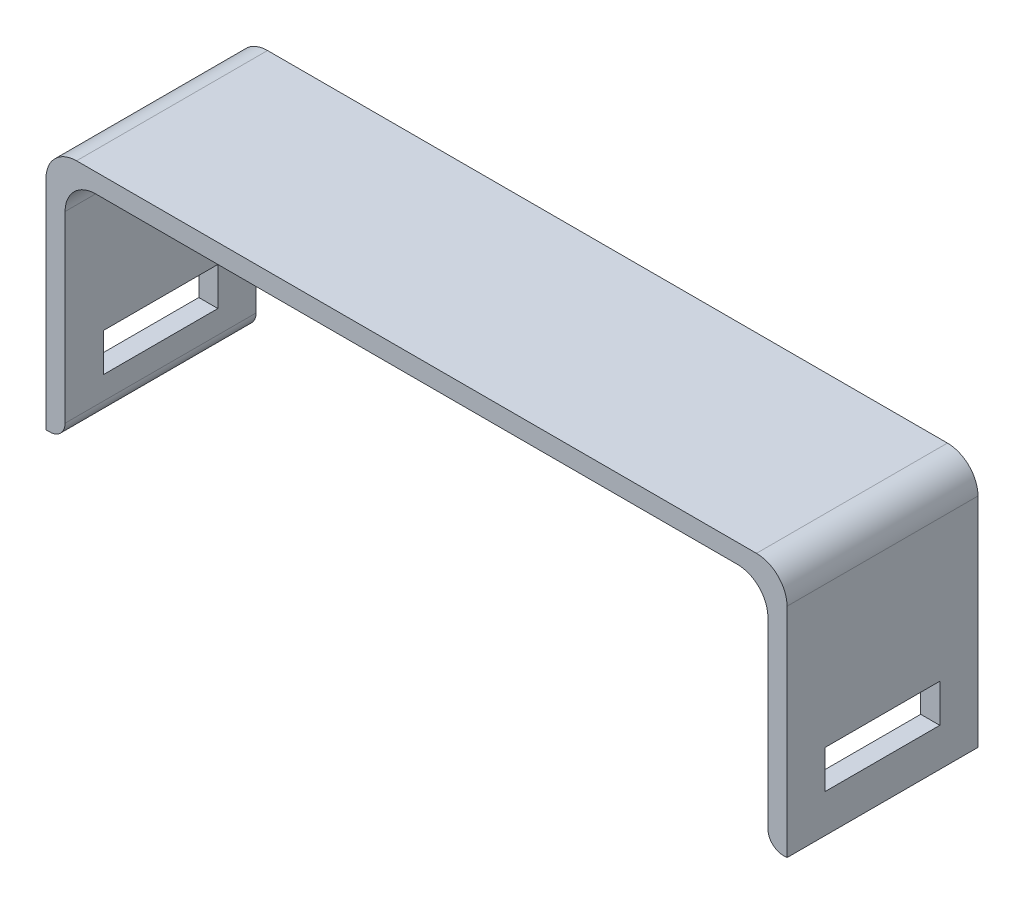
ISO-10303-21;
HEADER;
FILE_DESCRIPTION(('STEP AP214'),'2;1');
FILE_NAME('part.step','',(''),(''),'','','');
FILE_SCHEMA(('AUTOMOTIVE_DESIGN { 1 0 10303 214 1 1 1 1 }'));
ENDSEC;
DATA;
#1=APPLICATION_CONTEXT('core data for automotive mechanical design processes');
#2=APPLICATION_PROTOCOL_DEFINITION('international standard','automotive_design',2000,#1);
#3=PRODUCT_CONTEXT('',#1,'mechanical');
#4=PRODUCT('Part','Part','',(#3));
#5=PRODUCT_RELATED_PRODUCT_CATEGORY('part','',(#4));
#6=PRODUCT_DEFINITION_FORMATION('','',#4);
#7=PRODUCT_DEFINITION_CONTEXT('part definition',#1,'design');
#8=PRODUCT_DEFINITION('design','',#6,#7);
#9=PRODUCT_DEFINITION_SHAPE('','',#8);
#10=(LENGTH_UNIT() NAMED_UNIT(*) SI_UNIT(.MILLI.,.METRE.));
#11=(NAMED_UNIT(*) PLANE_ANGLE_UNIT() SI_UNIT($,.RADIAN.));
#12=(NAMED_UNIT(*) SI_UNIT($,.STERADIAN.) SOLID_ANGLE_UNIT());
#13=UNCERTAINTY_MEASURE_WITH_UNIT(LENGTH_MEASURE(1.E-05),#10,'distance_accuracy_value','');
#14=(GEOMETRIC_REPRESENTATION_CONTEXT(3) GLOBAL_UNCERTAINTY_ASSIGNED_CONTEXT((#13)) GLOBAL_UNIT_ASSIGNED_CONTEXT((#10,
#11,#12)) REPRESENTATION_CONTEXT('',''));
#15=CARTESIAN_POINT('',(0.,0.,0.));
#16=DIRECTION('',(0.,0.,1.));
#17=DIRECTION('',(1.,0.,0.));
#18=AXIS2_PLACEMENT_3D('',#15,#16,#17);
#19=CARTESIAN_POINT('',(3.175,0.,31.75));
#20=DIRECTION('',(0.,1.,0.));
#21=DIRECTION('',(-1.,0.,0.));
#22=AXIS2_PLACEMENT_3D('',#19,#20,#21);
#23=PLANE('',#22);
#24=DIRECTION('',(1.,0.,0.));
#25=VECTOR('',#24,1.);
#26=CARTESIAN_POINT('',(3.175,0.,0.));
#27=LINE('',#26,#25);
#28=CARTESIAN_POINT('',(0.,0.,0.));
#29=VERTEX_POINT('',#28);
#30=CARTESIAN_POINT('',(0.634999999999999,0.,0.));
#31=VERTEX_POINT('',#30);
#32=EDGE_CURVE('E258',#29,#31,#27,.T.);
#33=ORIENTED_EDGE('',*,*,#32,.T.);
#34=DIRECTION('',(0.,0.,-1.));
#35=VECTOR('',#34,1.);
#36=CARTESIAN_POINT('',(0.634999999999999,0.,31.75));
#37=LINE('',#36,#35);
#38=CARTESIAN_POINT('',(0.634999999999999,0.,31.75));
#39=VERTEX_POINT('',#38);
#40=EDGE_CURVE('E349',#31,#39,#37,.F.);
#41=ORIENTED_EDGE('',*,*,#40,.T.);
#42=DIRECTION('',(1.,0.,0.));
#43=VECTOR('',#42,1.);
#44=CARTESIAN_POINT('',(3.175,0.,31.75));
#45=LINE('',#44,#43);
#46=CARTESIAN_POINT('',(0.,0.,31.75));
#47=VERTEX_POINT('',#46);
#48=EDGE_CURVE('E259',#47,#39,#45,.T.);
#49=ORIENTED_EDGE('',*,*,#48,.F.);
#50=DIRECTION('',(0.,0.,-1.));
#51=VECTOR('',#50,1.);
#52=CARTESIAN_POINT('',(0.,0.,31.75));
#53=LINE('',#52,#51);
#54=EDGE_CURVE('E280',#47,#29,#53,.T.);
#55=ORIENTED_EDGE('',*,*,#54,.T.);
#56=EDGE_LOOP('',(#33,#41,#49,#55));
#57=FACE_BOUND('',#56,.T.);
#58=ADVANCED_FACE('F37',(#57),#23,.F.);
#59=CARTESIAN_POINT('',(3.175,38.1,31.75));
#60=DIRECTION('',(-1.,0.,0.));
#61=DIRECTION('',(0.,-1.,0.));
#62=AXIS2_PLACEMENT_3D('',#59,#60,#61);
#63=PLANE('',#62);
#64=DIRECTION('',(0.,0.,1.));
#65=VECTOR('',#64,1.);
#66=CARTESIAN_POINT('',(3.175,6.35,31.75));
#67=LINE('',#66,#65);
#68=CARTESIAN_POINT('',(3.175,6.35,6.35));
#69=VERTEX_POINT('',#68);
#70=CARTESIAN_POINT('',(3.175,6.35,25.4));
#71=VERTEX_POINT('',#70);
#72=EDGE_CURVE('E251',#69,#71,#67,.T.);
#73=ORIENTED_EDGE('',*,*,#72,.T.);
#74=DIRECTION('',(0.,1.,0.));
#75=VECTOR('',#74,1.);
#76=CARTESIAN_POINT('',(3.175,38.1,25.4));
#77=LINE('',#76,#75);
#78=CARTESIAN_POINT('',(3.175,12.7,25.4));
#79=VERTEX_POINT('',#78);
#80=EDGE_CURVE('E255',#71,#79,#77,.T.);
#81=ORIENTED_EDGE('',*,*,#80,.T.);
#82=DIRECTION('',(0.,0.,-1.));
#83=VECTOR('',#82,1.);
#84=CARTESIAN_POINT('',(3.175,12.7,31.75));
#85=LINE('',#84,#83);
#86=CARTESIAN_POINT('',(3.175,12.7,6.35));
#87=VERTEX_POINT('',#86);
#88=EDGE_CURVE('E239',#79,#87,#85,.T.);
#89=ORIENTED_EDGE('',*,*,#88,.T.);
#90=DIRECTION('',(0.,-1.,0.));
#91=VECTOR('',#90,1.);
#92=CARTESIAN_POINT('',(3.175,38.1,6.35));
#93=LINE('',#92,#91);
#94=EDGE_CURVE('E245',#87,#69,#93,.T.);
#95=ORIENTED_EDGE('',*,*,#94,.T.);
#96=EDGE_LOOP('',(#73,#81,#89,#95));
#97=FACE_BOUND('',#96,.T.);
#98=DIRECTION('',(0.,1.,0.));
#99=VECTOR('',#98,1.);
#100=CARTESIAN_POINT('',(3.175,38.1,31.75));
#101=LINE('',#100,#99);
#102=CARTESIAN_POINT('',(3.175,2.54000000000001,31.75));
#103=VERTEX_POINT('',#102);
#104=CARTESIAN_POINT('',(3.175,33.02,31.75));
#105=VERTEX_POINT('',#104);
#106=EDGE_CURVE('E262',#103,#105,#101,.T.);
#107=ORIENTED_EDGE('',*,*,#106,.F.);
#108=DIRECTION('',(0.,0.,-1.));
#109=VECTOR('',#108,1.);
#110=CARTESIAN_POINT('',(3.175,2.54,31.75));
#111=LINE('',#110,#109);
#112=CARTESIAN_POINT('',(3.175,2.54000000000001,0.));
#113=VERTEX_POINT('',#112);
#114=EDGE_CURVE('E342',#103,#113,#111,.T.);
#115=ORIENTED_EDGE('',*,*,#114,.T.);
#116=DIRECTION('',(0.,1.,0.));
#117=VECTOR('',#116,1.);
#118=CARTESIAN_POINT('',(3.175,38.1,0.));
#119=LINE('',#118,#117);
#120=CARTESIAN_POINT('',(3.175,33.02,0.));
#121=VERTEX_POINT('',#120);
#122=EDGE_CURVE('E283',#113,#121,#119,.T.);
#123=ORIENTED_EDGE('',*,*,#122,.T.);
#124=DIRECTION('',(0.,0.,-1.));
#125=VECTOR('',#124,1.);
#126=CARTESIAN_POINT('',(3.175,33.02,31.75));
#127=LINE('',#126,#125);
#128=EDGE_CURVE('E330',#121,#105,#127,.F.);
#129=ORIENTED_EDGE('',*,*,#128,.T.);
#130=EDGE_LOOP('',(#107,#115,#123,#129));
#131=FACE_BOUND('',#130,.T.);
#132=ADVANCED_FACE('F396',(#97,#131),#63,.F.);
#133=CARTESIAN_POINT('',(120.015,38.1,31.75));
#134=DIRECTION('',(0.,1.,0.));
#135=DIRECTION('',(-1.,0.,0.));
#136=AXIS2_PLACEMENT_3D('',#133,#134,#135);
#137=PLANE('',#136);
#138=DIRECTION('',(1.,0.,0.));
#139=VECTOR('',#138,1.);
#140=CARTESIAN_POINT('',(120.015,38.1,0.));
#141=LINE('',#140,#139);
#142=CARTESIAN_POINT('',(8.25500000000003,38.1,0.));
#143=VERTEX_POINT('',#142);
#144=CARTESIAN_POINT('',(114.935,38.1,0.));
#145=VERTEX_POINT('',#144);
#146=EDGE_CURVE('E285',#143,#145,#141,.T.);
#147=ORIENTED_EDGE('',*,*,#146,.T.);
#148=DIRECTION('',(0.,0.,-1.));
#149=VECTOR('',#148,1.);
#150=CARTESIAN_POINT('',(114.935,38.1,31.75));
#151=LINE('',#150,#149);
#152=CARTESIAN_POINT('',(114.935,38.1,31.75));
#153=VERTEX_POINT('',#152);
#154=EDGE_CURVE('E328',#145,#153,#151,.F.);
#155=ORIENTED_EDGE('',*,*,#154,.T.);
#156=DIRECTION('',(1.,0.,0.));
#157=VECTOR('',#156,1.);
#158=CARTESIAN_POINT('',(120.015,38.1,31.75));
#159=LINE('',#158,#157);
#160=CARTESIAN_POINT('',(8.25500000000003,38.1,31.75));
#161=VERTEX_POINT('',#160);
#162=EDGE_CURVE('E265',#161,#153,#159,.T.);
#163=ORIENTED_EDGE('',*,*,#162,.F.);
#164=DIRECTION('',(0.,0.,-1.));
#165=VECTOR('',#164,1.);
#166=CARTESIAN_POINT('',(8.255,38.1,0.));
#167=LINE('',#166,#165);
#168=EDGE_CURVE('E325',#161,#143,#167,.T.);
#169=ORIENTED_EDGE('',*,*,#168,.T.);
#170=EDGE_LOOP('',(#147,#155,#163,#169));
#171=FACE_BOUND('',#170,.T.);
#172=ADVANCED_FACE('F406',(#171),#137,.F.);
#173=CARTESIAN_POINT('',(120.015,0.,31.75));
#174=DIRECTION('',(1.,0.,0.));
#175=DIRECTION('',(0.,0.,-1.));
#176=AXIS2_PLACEMENT_3D('',#173,#174,#175);
#177=PLANE('',#176);
#178=DIRECTION('',(0.,0.,1.));
#179=VECTOR('',#178,1.);
#180=CARTESIAN_POINT('',(120.015,12.7,31.75));
#181=LINE('',#180,#179);
#182=CARTESIAN_POINT('',(120.015,12.7,6.35));
#183=VERTEX_POINT('',#182);
#184=CARTESIAN_POINT('',(120.015,12.7,25.4));
#185=VERTEX_POINT('',#184);
#186=EDGE_CURVE('E231',#183,#185,#181,.T.);
#187=ORIENTED_EDGE('',*,*,#186,.T.);
#188=DIRECTION('',(0.,-1.,0.));
#189=VECTOR('',#188,1.);
#190=CARTESIAN_POINT('',(120.015,0.,25.4));
#191=LINE('',#190,#189);
#192=CARTESIAN_POINT('',(120.015,6.35,25.4));
#193=VERTEX_POINT('',#192);
#194=EDGE_CURVE('E194',#185,#193,#191,.T.);
#195=ORIENTED_EDGE('',*,*,#194,.T.);
#196=DIRECTION('',(0.,0.,-1.));
#197=VECTOR('',#196,1.);
#198=CARTESIAN_POINT('',(120.015,6.35,31.75));
#199=LINE('',#198,#197);
#200=CARTESIAN_POINT('',(120.015,6.35,6.35));
#201=VERTEX_POINT('',#200);
#202=EDGE_CURVE('E248',#193,#201,#199,.T.);
#203=ORIENTED_EDGE('',*,*,#202,.T.);
#204=DIRECTION('',(0.,1.,0.));
#205=VECTOR('',#204,1.);
#206=CARTESIAN_POINT('',(120.015,0.,6.35));
#207=LINE('',#206,#205);
#208=EDGE_CURVE('E242',#201,#183,#207,.T.);
#209=ORIENTED_EDGE('',*,*,#208,.T.);
#210=EDGE_LOOP('',(#187,#195,#203,#209));
#211=FACE_BOUND('',#210,.T.);
#212=DIRECTION('',(0.,-1.,0.));
#213=VECTOR('',#212,1.);
#214=CARTESIAN_POINT('',(120.015,0.,0.));
#215=LINE('',#214,#213);
#216=CARTESIAN_POINT('',(120.015,33.02,0.));
#217=VERTEX_POINT('',#216);
#218=CARTESIAN_POINT('',(120.015,2.54,0.));
#219=VERTEX_POINT('',#218);
#220=EDGE_CURVE('E288',#217,#219,#215,.T.);
#221=ORIENTED_EDGE('',*,*,#220,.T.);
#222=DIRECTION('',(0.,0.,-1.));
#223=VECTOR('',#222,1.);
#224=CARTESIAN_POINT('',(120.015,2.54,31.75));
#225=LINE('',#224,#223);
#226=CARTESIAN_POINT('',(120.015,2.54,31.75));
#227=VERTEX_POINT('',#226);
#228=EDGE_CURVE('E11',#219,#227,#225,.F.);
#229=ORIENTED_EDGE('',*,*,#228,.T.);
#230=DIRECTION('',(0.,-1.,0.));
#231=VECTOR('',#230,1.);
#232=CARTESIAN_POINT('',(120.015,0.,31.75));
#233=LINE('',#232,#231);
#234=CARTESIAN_POINT('',(120.015,33.02,31.75));
#235=VERTEX_POINT('',#234);
#236=EDGE_CURVE('E268',#235,#227,#233,.T.);
#237=ORIENTED_EDGE('',*,*,#236,.F.);
#238=DIRECTION('',(0.,0.,-1.));
#239=VECTOR('',#238,1.);
#240=CARTESIAN_POINT('',(120.015,33.02,0.));
#241=LINE('',#240,#239);
#242=EDGE_CURVE('E322',#235,#217,#241,.T.);
#243=ORIENTED_EDGE('',*,*,#242,.T.);
#244=EDGE_LOOP('',(#221,#229,#237,#243));
#245=FACE_BOUND('',#244,.T.);
#246=ADVANCED_FACE('F411',(#211,#245),#177,.F.);
#247=CARTESIAN_POINT('',(123.19,0.,31.75));
#248=DIRECTION('',(0.,1.,0.));
#249=DIRECTION('',(-1.,0.,0.));
#250=AXIS2_PLACEMENT_3D('',#247,#248,#249);
#251=PLANE('',#250);
#252=DIRECTION('',(1.,0.,0.));
#253=VECTOR('',#252,1.);
#254=CARTESIAN_POINT('',(123.19,0.,31.75));
#255=LINE('',#254,#253);
#256=CARTESIAN_POINT('',(122.555,0.,31.75));
#257=VERTEX_POINT('',#256);
#258=CARTESIAN_POINT('',(123.19,0.,31.75));
#259=VERTEX_POINT('',#258);
#260=EDGE_CURVE('E270',#257,#259,#255,.T.);
#261=ORIENTED_EDGE('',*,*,#260,.F.);
#262=DIRECTION('',(0.,0.,-1.));
#263=VECTOR('',#262,1.);
#264=CARTESIAN_POINT('',(122.555,0.,31.75));
#265=LINE('',#264,#263);
#266=CARTESIAN_POINT('',(122.555,0.,0.));
#267=VERTEX_POINT('',#266);
#268=EDGE_CURVE('E45',#257,#267,#265,.T.);
#269=ORIENTED_EDGE('',*,*,#268,.T.);
#270=DIRECTION('',(1.,0.,0.));
#271=VECTOR('',#270,1.);
#272=CARTESIAN_POINT('',(123.19,0.,0.));
#273=LINE('',#272,#271);
#274=CARTESIAN_POINT('',(123.19,0.,0.));
#275=VERTEX_POINT('',#274);
#276=EDGE_CURVE('E290',#267,#275,#273,.T.);
#277=ORIENTED_EDGE('',*,*,#276,.T.);
#278=DIRECTION('',(0.,0.,-1.));
#279=VECTOR('',#278,1.);
#280=CARTESIAN_POINT('',(123.19,0.,31.75));
#281=LINE('',#280,#279);
#282=EDGE_CURVE('E301',#259,#275,#281,.T.);
#283=ORIENTED_EDGE('',*,*,#282,.F.);
#284=EDGE_LOOP('',(#261,#269,#277,#283));
#285=FACE_BOUND('',#284,.T.);
#286=ADVANCED_FACE('F357',(#285),#251,.F.);
#287=CARTESIAN_POINT('',(123.19,41.275,31.75));
#288=DIRECTION('',(-1.,0.,0.));
#289=DIRECTION('',(0.,0.,1.));
#290=AXIS2_PLACEMENT_3D('',#287,#288,#289);
#291=PLANE('',#290);
#292=DIRECTION('',(0.,0.,1.));
#293=VECTOR('',#292,1.);
#294=CARTESIAN_POINT('',(123.19,6.35,6.35));
#295=LINE('',#294,#293);
#296=CARTESIAN_POINT('',(123.19,6.35,6.35));
#297=VERTEX_POINT('',#296);
#298=CARTESIAN_POINT('',(123.19,6.35,25.4));
#299=VERTEX_POINT('',#298);
#300=EDGE_CURVE('E213',#297,#299,#295,.T.);
#301=ORIENTED_EDGE('',*,*,#300,.T.);
#302=DIRECTION('',(0.,1.,0.));
#303=VECTOR('',#302,1.);
#304=CARTESIAN_POINT('',(123.19,12.7,25.4));
#305=LINE('',#304,#303);
#306=CARTESIAN_POINT('',(123.19,12.7,25.4));
#307=VERTEX_POINT('',#306);
#308=EDGE_CURVE('E191',#299,#307,#305,.T.);
#309=ORIENTED_EDGE('',*,*,#308,.T.);
#310=DIRECTION('',(0.,0.,-1.));
#311=VECTOR('',#310,1.);
#312=CARTESIAN_POINT('',(123.19,12.7,6.35));
#313=LINE('',#312,#311);
#314=CARTESIAN_POINT('',(123.19,12.7,6.35));
#315=VERTEX_POINT('',#314);
#316=EDGE_CURVE('E202',#307,#315,#313,.T.);
#317=ORIENTED_EDGE('',*,*,#316,.T.);
#318=DIRECTION('',(0.,-1.,0.));
#319=VECTOR('',#318,1.);
#320=CARTESIAN_POINT('',(123.19,12.7,6.35));
#321=LINE('',#320,#319);
#322=EDGE_CURVE('E208',#315,#297,#321,.T.);
#323=ORIENTED_EDGE('',*,*,#322,.T.);
#324=EDGE_LOOP('',(#301,#309,#317,#323));
#325=FACE_BOUND('',#324,.T.);
#326=DIRECTION('',(0.,1.,0.));
#327=VECTOR('',#326,1.);
#328=CARTESIAN_POINT('',(123.19,41.275,0.));
#329=LINE('',#328,#327);
#330=CARTESIAN_POINT('',(123.19,36.195,0.));
#331=VERTEX_POINT('',#330);
#332=EDGE_CURVE('E292',#275,#331,#329,.T.);
#333=ORIENTED_EDGE('',*,*,#332,.T.);
#334=DIRECTION('',(0.,0.,-1.));
#335=VECTOR('',#334,1.);
#336=CARTESIAN_POINT('',(123.19,36.195,31.75));
#337=LINE('',#336,#335);
#338=CARTESIAN_POINT('',(123.19,36.195,31.75));
#339=VERTEX_POINT('',#338);
#340=EDGE_CURVE('E313',#331,#339,#337,.F.);
#341=ORIENTED_EDGE('',*,*,#340,.T.);
#342=DIRECTION('',(0.,1.,0.));
#343=VECTOR('',#342,1.);
#344=CARTESIAN_POINT('',(123.19,41.275,31.75));
#345=LINE('',#344,#343);
#346=EDGE_CURVE('E272',#259,#339,#345,.T.);
#347=ORIENTED_EDGE('',*,*,#346,.F.);
#348=ORIENTED_EDGE('',*,*,#282,.T.);
#349=EDGE_LOOP('',(#333,#341,#347,#348));
#350=FACE_BOUND('',#349,.T.);
#351=ADVANCED_FACE('F210',(#325,#350),#291,.F.);
#352=CARTESIAN_POINT('',(0.,41.275,31.75));
#353=DIRECTION('',(0.,-1.,0.));
#354=DIRECTION('',(0.,0.,-1.));
#355=AXIS2_PLACEMENT_3D('',#352,#353,#354);
#356=PLANE('',#355);
#357=DIRECTION('',(-1.,0.,0.));
#358=VECTOR('',#357,1.);
#359=CARTESIAN_POINT('',(0.,41.275,31.75));
#360=LINE('',#359,#358);
#361=CARTESIAN_POINT('',(118.11,41.275,31.75));
#362=VERTEX_POINT('',#361);
#363=CARTESIAN_POINT('',(5.08,41.275,31.75));
#364=VERTEX_POINT('',#363);
#365=EDGE_CURVE('E275',#362,#364,#360,.T.);
#366=ORIENTED_EDGE('',*,*,#365,.F.);
#367=DIRECTION('',(0.,0.,-1.));
#368=VECTOR('',#367,1.);
#369=CARTESIAN_POINT('',(118.11,41.275,31.75));
#370=LINE('',#369,#368);
#371=CARTESIAN_POINT('',(118.11,41.275,0.));
#372=VERTEX_POINT('',#371);
#373=EDGE_CURVE('E306',#362,#372,#370,.T.);
#374=ORIENTED_EDGE('',*,*,#373,.T.);
#375=DIRECTION('',(-1.,0.,0.));
#376=VECTOR('',#375,1.);
#377=CARTESIAN_POINT('',(0.,41.275,0.));
#378=LINE('',#377,#376);
#379=CARTESIAN_POINT('',(5.08,41.275,0.));
#380=VERTEX_POINT('',#379);
#381=EDGE_CURVE('E295',#372,#380,#378,.T.);
#382=ORIENTED_EDGE('',*,*,#381,.T.);
#383=DIRECTION('',(0.,0.,-1.));
#384=VECTOR('',#383,1.);
#385=CARTESIAN_POINT('',(5.08,41.275,31.75));
#386=LINE('',#385,#384);
#387=EDGE_CURVE('E304',#380,#364,#386,.F.);
#388=ORIENTED_EDGE('',*,*,#387,.T.);
#389=EDGE_LOOP('',(#366,#374,#382,#388));
#390=FACE_BOUND('',#389,.T.);
#391=ADVANCED_FACE('F376',(#390),#356,.F.);
#392=CARTESIAN_POINT('',(0.,0.,31.75));
#393=DIRECTION('',(1.,0.,0.));
#394=DIRECTION('',(0.,0.,-1.));
#395=AXIS2_PLACEMENT_3D('',#392,#393,#394);
#396=PLANE('',#395);
#397=DIRECTION('',(0.,0.,-1.));
#398=VECTOR('',#397,1.);
#399=CARTESIAN_POINT('',(0.,12.7,6.35));
#400=LINE('',#399,#398);
#401=CARTESIAN_POINT('',(0.,12.7,25.4));
#402=VERTEX_POINT('',#401);
#403=CARTESIAN_POINT('',(0.,12.7,6.35));
#404=VERTEX_POINT('',#403);
#405=EDGE_CURVE('E224',#402,#404,#400,.T.);
#406=ORIENTED_EDGE('',*,*,#405,.F.);
#407=DIRECTION('',(0.,1.,0.));
#408=VECTOR('',#407,1.);
#409=CARTESIAN_POINT('',(0.,12.7,25.4));
#410=LINE('',#409,#408);
#411=CARTESIAN_POINT('',(0.,6.35,25.4));
#412=VERTEX_POINT('',#411);
#413=EDGE_CURVE('E222',#412,#402,#410,.T.);
#414=ORIENTED_EDGE('',*,*,#413,.F.);
#415=DIRECTION('',(0.,0.,1.));
#416=VECTOR('',#415,1.);
#417=CARTESIAN_POINT('',(0.,6.35,6.35));
#418=LINE('',#417,#416);
#419=CARTESIAN_POINT('',(0.,6.35,6.35));
#420=VERTEX_POINT('',#419);
#421=EDGE_CURVE('E214',#420,#412,#418,.T.);
#422=ORIENTED_EDGE('',*,*,#421,.F.);
#423=DIRECTION('',(0.,-1.,0.));
#424=VECTOR('',#423,1.);
#425=CARTESIAN_POINT('',(0.,12.7,6.35));
#426=LINE('',#425,#424);
#427=EDGE_CURVE('E217',#404,#420,#426,.T.);
#428=ORIENTED_EDGE('',*,*,#427,.F.);
#429=EDGE_LOOP('',(#406,#414,#422,#428));
#430=FACE_BOUND('',#429,.T.);
#431=DIRECTION('',(0.,-1.,0.));
#432=VECTOR('',#431,1.);
#433=CARTESIAN_POINT('',(0.,0.,31.75));
#434=LINE('',#433,#432);
#435=CARTESIAN_POINT('',(0.,36.195,31.75));
#436=VERTEX_POINT('',#435);
#437=EDGE_CURVE('E278',#436,#47,#434,.T.);
#438=ORIENTED_EDGE('',*,*,#437,.F.);
#439=DIRECTION('',(0.,0.,-1.));
#440=VECTOR('',#439,1.);
#441=CARTESIAN_POINT('',(0.,36.195,31.75));
#442=LINE('',#441,#440);
#443=CARTESIAN_POINT('',(0.,36.195,0.));
#444=VERTEX_POINT('',#443);
#445=EDGE_CURVE('E319',#436,#444,#442,.T.);
#446=ORIENTED_EDGE('',*,*,#445,.T.);
#447=DIRECTION('',(0.,-1.,0.));
#448=VECTOR('',#447,1.);
#449=CARTESIAN_POINT('',(0.,0.,0.));
#450=LINE('',#449,#448);
#451=EDGE_CURVE('E263',#444,#29,#450,.T.);
#452=ORIENTED_EDGE('',*,*,#451,.T.);
#453=ORIENTED_EDGE('',*,*,#54,.F.);
#454=EDGE_LOOP('',(#438,#446,#452,#453));
#455=FACE_BOUND('',#454,.T.);
#456=ADVANCED_FACE('F384',(#430,#455),#396,.F.);
#457=CARTESIAN_POINT('',(0.,0.,31.75));
#458=DIRECTION('',(0.,0.,-1.));
#459=DIRECTION('',(-1.,0.,0.));
#460=AXIS2_PLACEMENT_3D('',#457,#458,#459);
#461=PLANE('',#460);
#462=ORIENTED_EDGE('',*,*,#48,.T.);
#463=CARTESIAN_POINT('',(0.634999999999999,2.54,31.75));
#464=DIRECTION('',(0.,0.,-1.));
#465=DIRECTION('',(-1.,0.,0.));
#466=AXIS2_PLACEMENT_3D('',#463,#464,#465);
#467=CIRCLE('',#466,2.54);
#468=EDGE_CURVE('E352',#39,#103,#467,.F.);
#469=ORIENTED_EDGE('',*,*,#468,.T.);
#470=ORIENTED_EDGE('',*,*,#106,.T.);
#471=CARTESIAN_POINT('',(8.255,33.02,31.75));
#472=DIRECTION('',(0.,0.,-1.));
#473=DIRECTION('',(-1.,0.,0.));
#474=AXIS2_PLACEMENT_3D('',#471,#472,#473);
#475=CIRCLE('',#474,5.08);
#476=EDGE_CURVE('E340',#105,#161,#475,.T.);
#477=ORIENTED_EDGE('',*,*,#476,.T.);
#478=ORIENTED_EDGE('',*,*,#162,.T.);
#479=CARTESIAN_POINT('',(114.935,33.02,31.75));
#480=DIRECTION('',(0.,0.,-1.));
#481=DIRECTION('',(-1.,0.,0.));
#482=AXIS2_PLACEMENT_3D('',#479,#480,#481);
#483=CIRCLE('',#482,5.08);
#484=EDGE_CURVE('E335',#153,#235,#483,.T.);
#485=ORIENTED_EDGE('',*,*,#484,.T.);
#486=ORIENTED_EDGE('',*,*,#236,.T.);
#487=CARTESIAN_POINT('',(122.555,2.54,31.75));
#488=DIRECTION('',(0.,0.,-1.));
#489=DIRECTION('',(-1.,0.,0.));
#490=AXIS2_PLACEMENT_3D('',#487,#488,#489);
#491=CIRCLE('',#490,2.54);
#492=EDGE_CURVE('E52',#227,#257,#491,.F.);
#493=ORIENTED_EDGE('',*,*,#492,.T.);
#494=ORIENTED_EDGE('',*,*,#260,.T.);
#495=ORIENTED_EDGE('',*,*,#346,.T.);
#496=CARTESIAN_POINT('',(118.11,36.195,31.75));
#497=DIRECTION('',(0.,0.,-1.));
#498=DIRECTION('',(-1.,0.,0.));
#499=AXIS2_PLACEMENT_3D('',#496,#497,#498);
#500=CIRCLE('',#499,5.08);
#501=EDGE_CURVE('E317',#339,#362,#500,.F.);
#502=ORIENTED_EDGE('',*,*,#501,.T.);
#503=ORIENTED_EDGE('',*,*,#365,.T.);
#504=CARTESIAN_POINT('',(5.08,36.195,31.75));
#505=DIRECTION('',(0.,0.,-1.));
#506=DIRECTION('',(-1.,0.,0.));
#507=AXIS2_PLACEMENT_3D('',#504,#505,#506);
#508=CIRCLE('',#507,5.08);
#509=EDGE_CURVE('E315',#364,#436,#508,.F.);
#510=ORIENTED_EDGE('',*,*,#509,.T.);
#511=ORIENTED_EDGE('',*,*,#437,.T.);
#512=EDGE_LOOP('',(#462,#469,#470,#477,#478,#485,#486,#493,#494,#495,#502,#503,#510,#511));
#513=FACE_BOUND('',#512,.T.);
#514=ADVANCED_FACE('F373',(#513),#461,.F.);
#515=CARTESIAN_POINT('',(0.,0.,0.));
#516=DIRECTION('',(0.,0.,-1.));
#517=DIRECTION('',(-1.,0.,0.));
#518=AXIS2_PLACEMENT_3D('',#515,#516,#517);
#519=PLANE('',#518);
#520=ORIENTED_EDGE('',*,*,#122,.F.);
#521=CARTESIAN_POINT('',(0.634999999999999,2.54,0.));
#522=DIRECTION('',(0.,0.,-1.));
#523=DIRECTION('',(-1.,0.,0.));
#524=AXIS2_PLACEMENT_3D('',#521,#522,#523);
#525=CIRCLE('',#524,2.54);
#526=EDGE_CURVE('E347',#113,#31,#525,.T.);
#527=ORIENTED_EDGE('',*,*,#526,.T.);
#528=ORIENTED_EDGE('',*,*,#32,.F.);
#529=ORIENTED_EDGE('',*,*,#451,.F.);
#530=CARTESIAN_POINT('',(5.08,36.195,0.));
#531=DIRECTION('',(0.,0.,-1.));
#532=DIRECTION('',(-1.,0.,0.));
#533=AXIS2_PLACEMENT_3D('',#530,#531,#532);
#534=CIRCLE('',#533,5.08);
#535=EDGE_CURVE('E309',#444,#380,#534,.T.);
#536=ORIENTED_EDGE('',*,*,#535,.T.);
#537=ORIENTED_EDGE('',*,*,#381,.F.);
#538=CARTESIAN_POINT('',(118.11,36.195,0.));
#539=DIRECTION('',(0.,0.,-1.));
#540=DIRECTION('',(-1.,0.,0.));
#541=AXIS2_PLACEMENT_3D('',#538,#539,#540);
#542=CIRCLE('',#541,5.08);
#543=EDGE_CURVE('E311',#372,#331,#542,.T.);
#544=ORIENTED_EDGE('',*,*,#543,.T.);
#545=ORIENTED_EDGE('',*,*,#332,.F.);
#546=ORIENTED_EDGE('',*,*,#276,.F.);
#547=CARTESIAN_POINT('',(122.555,2.54,0.));
#548=DIRECTION('',(0.,0.,-1.));
#549=DIRECTION('',(-1.,0.,0.));
#550=AXIS2_PLACEMENT_3D('',#547,#548,#549);
#551=CIRCLE('',#550,2.54);
#552=EDGE_CURVE('E345',#267,#219,#551,.T.);
#553=ORIENTED_EDGE('',*,*,#552,.T.);
#554=ORIENTED_EDGE('',*,*,#220,.F.);
#555=CARTESIAN_POINT('',(114.935,33.02,0.));
#556=DIRECTION('',(0.,0.,-1.));
#557=DIRECTION('',(-1.,0.,0.));
#558=AXIS2_PLACEMENT_3D('',#555,#556,#557);
#559=CIRCLE('',#558,5.08);
#560=EDGE_CURVE('E333',#217,#145,#559,.F.);
#561=ORIENTED_EDGE('',*,*,#560,.T.);
#562=ORIENTED_EDGE('',*,*,#146,.F.);
#563=CARTESIAN_POINT('',(8.255,33.02,0.));
#564=DIRECTION('',(0.,0.,-1.));
#565=DIRECTION('',(-1.,0.,0.));
#566=AXIS2_PLACEMENT_3D('',#563,#564,#565);
#567=CIRCLE('',#566,5.08);
#568=EDGE_CURVE('E337',#143,#121,#567,.F.);
#569=ORIENTED_EDGE('',*,*,#568,.T.);
#570=EDGE_LOOP('',(#520,#527,#528,#529,#536,#537,#544,#545,#546,#553,#554,#561,#562,#569));
#571=FACE_BOUND('',#570,.T.);
#572=ADVANCED_FACE('F363',(#571),#519,.T.);
#573=CARTESIAN_POINT('',(123.19,12.7,6.35));
#574=DIRECTION('',(0.,1.,0.));
#575=DIRECTION('',(0.,0.,1.));
#576=AXIS2_PLACEMENT_3D('',#573,#574,#575);
#577=PLANE('',#576);
#578=DIRECTION('',(-1.,0.,0.));
#579=VECTOR('',#578,1.);
#580=CARTESIAN_POINT('',(123.19,12.7,25.4));
#581=LINE('',#580,#579);
#582=EDGE_CURVE('E198',#79,#402,#581,.T.);
#583=ORIENTED_EDGE('',*,*,#582,.T.);
#584=ORIENTED_EDGE('',*,*,#405,.T.);
#585=DIRECTION('',(-1.,0.,0.));
#586=VECTOR('',#585,1.);
#587=CARTESIAN_POINT('',(123.19,12.7,6.35));
#588=LINE('',#587,#586);
#589=EDGE_CURVE('E197',#87,#404,#588,.T.);
#590=ORIENTED_EDGE('',*,*,#589,.F.);
#591=ORIENTED_EDGE('',*,*,#88,.F.);
#592=EDGE_LOOP('',(#583,#584,#590,#591));
#593=FACE_BOUND('',#592,.T.);
#594=ADVANCED_FACE('F485',(#593),#577,.F.);
#595=CARTESIAN_POINT('',(123.19,12.7,6.35));
#596=DIRECTION('',(0.,0.,-1.));
#597=DIRECTION('',(0.,1.,0.));
#598=AXIS2_PLACEMENT_3D('',#595,#596,#597);
#599=PLANE('',#598);
#600=ORIENTED_EDGE('',*,*,#589,.T.);
#601=ORIENTED_EDGE('',*,*,#427,.T.);
#602=DIRECTION('',(-1.,0.,0.));
#603=VECTOR('',#602,1.);
#604=CARTESIAN_POINT('',(123.19,6.35,6.35));
#605=LINE('',#604,#603);
#606=EDGE_CURVE('E236',#69,#420,#605,.T.);
#607=ORIENTED_EDGE('',*,*,#606,.F.);
#608=ORIENTED_EDGE('',*,*,#94,.F.);
#609=EDGE_LOOP('',(#600,#601,#607,#608));
#610=FACE_BOUND('',#609,.T.);
#611=ADVANCED_FACE('F496',(#610),#599,.F.);
#612=CARTESIAN_POINT('',(123.19,6.35,6.35));
#613=DIRECTION('',(0.,-1.,0.));
#614=DIRECTION('',(0.,0.,-1.));
#615=AXIS2_PLACEMENT_3D('',#612,#613,#614);
#616=PLANE('',#615);
#617=ORIENTED_EDGE('',*,*,#606,.T.);
#618=ORIENTED_EDGE('',*,*,#421,.T.);
#619=DIRECTION('',(-1.,0.,0.));
#620=VECTOR('',#619,1.);
#621=CARTESIAN_POINT('',(123.19,6.35,25.4));
#622=LINE('',#621,#620);
#623=EDGE_CURVE('E232',#71,#412,#622,.T.);
#624=ORIENTED_EDGE('',*,*,#623,.F.);
#625=ORIENTED_EDGE('',*,*,#72,.F.);
#626=EDGE_LOOP('',(#617,#618,#624,#625));
#627=FACE_BOUND('',#626,.T.);
#628=ADVANCED_FACE('F506',(#627),#616,.F.);
#629=CARTESIAN_POINT('',(123.19,12.7,25.4));
#630=DIRECTION('',(0.,0.,1.));
#631=DIRECTION('',(1.,0.,0.));
#632=AXIS2_PLACEMENT_3D('',#629,#630,#631);
#633=PLANE('',#632);
#634=ORIENTED_EDGE('',*,*,#623,.T.);
#635=ORIENTED_EDGE('',*,*,#413,.T.);
#636=ORIENTED_EDGE('',*,*,#582,.F.);
#637=ORIENTED_EDGE('',*,*,#80,.F.);
#638=EDGE_LOOP('',(#634,#635,#636,#637));
#639=FACE_BOUND('',#638,.T.);
#640=ADVANCED_FACE('F514',(#639),#633,.F.);
#641=EDGE_CURVE('E186',#307,#185,#581,.T.);
#642=ORIENTED_EDGE('',*,*,#641,.F.);
#643=ORIENTED_EDGE('',*,*,#308,.F.);
#644=EDGE_CURVE('E229',#299,#193,#622,.T.);
#645=ORIENTED_EDGE('',*,*,#644,.T.);
#646=ORIENTED_EDGE('',*,*,#194,.F.);
#647=EDGE_LOOP('',(#642,#643,#645,#646));
#648=FACE_BOUND('',#647,.T.);
#649=ADVANCED_FACE('F188',(#648),#633,.F.);
#650=ORIENTED_EDGE('',*,*,#644,.F.);
#651=ORIENTED_EDGE('',*,*,#300,.F.);
#652=EDGE_CURVE('E233',#297,#201,#605,.T.);
#653=ORIENTED_EDGE('',*,*,#652,.T.);
#654=ORIENTED_EDGE('',*,*,#202,.F.);
#655=EDGE_LOOP('',(#650,#651,#653,#654));
#656=FACE_BOUND('',#655,.T.);
#657=ADVANCED_FACE('F493',(#656),#616,.F.);
#658=ORIENTED_EDGE('',*,*,#652,.F.);
#659=ORIENTED_EDGE('',*,*,#322,.F.);
#660=EDGE_CURVE('E205',#315,#183,#588,.T.);
#661=ORIENTED_EDGE('',*,*,#660,.T.);
#662=ORIENTED_EDGE('',*,*,#208,.F.);
#663=EDGE_LOOP('',(#658,#659,#661,#662));
#664=FACE_BOUND('',#663,.T.);
#665=ADVANCED_FACE('F483',(#664),#599,.F.);
#666=ORIENTED_EDGE('',*,*,#660,.F.);
#667=ORIENTED_EDGE('',*,*,#316,.F.);
#668=ORIENTED_EDGE('',*,*,#641,.T.);
#669=ORIENTED_EDGE('',*,*,#186,.F.);
#670=EDGE_LOOP('',(#666,#667,#668,#669));
#671=FACE_BOUND('',#670,.T.);
#672=ADVANCED_FACE('F203',(#671),#577,.F.);
#673=CARTESIAN_POINT('',(118.11,36.195,31.75));
#674=DIRECTION('',(0.,0.,-1.));
#675=DIRECTION('',(-1.,0.,0.));
#676=AXIS2_PLACEMENT_3D('',#673,#674,#675);
#677=CYLINDRICAL_SURFACE('',#676,5.08);
#678=ORIENTED_EDGE('',*,*,#501,.F.);
#679=ORIENTED_EDGE('',*,*,#340,.F.);
#680=ORIENTED_EDGE('',*,*,#543,.F.);
#681=ORIENTED_EDGE('',*,*,#373,.F.);
#682=EDGE_LOOP('',(#678,#679,#680,#681));
#683=FACE_BOUND('',#682,.T.);
#684=ADVANCED_FACE('F370',(#683),#677,.T.);
#685=CARTESIAN_POINT('',(5.08,36.195,31.75));
#686=DIRECTION('',(0.,0.,-1.));
#687=DIRECTION('',(-1.,0.,0.));
#688=AXIS2_PLACEMENT_3D('',#685,#686,#687);
#689=CYLINDRICAL_SURFACE('',#688,5.08);
#690=ORIENTED_EDGE('',*,*,#509,.F.);
#691=ORIENTED_EDGE('',*,*,#387,.F.);
#692=ORIENTED_EDGE('',*,*,#535,.F.);
#693=ORIENTED_EDGE('',*,*,#445,.F.);
#694=EDGE_LOOP('',(#690,#691,#692,#693));
#695=FACE_BOUND('',#694,.T.);
#696=ADVANCED_FACE('F379',(#695),#689,.T.);
#697=CARTESIAN_POINT('',(114.935,33.02,31.75));
#698=DIRECTION('',(0.,0.,1.));
#699=DIRECTION('',(1.,0.,0.));
#700=AXIS2_PLACEMENT_3D('',#697,#698,#699);
#701=CYLINDRICAL_SURFACE('',#700,5.08);
#702=ORIENTED_EDGE('',*,*,#484,.F.);
#703=ORIENTED_EDGE('',*,*,#154,.F.);
#704=ORIENTED_EDGE('',*,*,#560,.F.);
#705=ORIENTED_EDGE('',*,*,#242,.F.);
#706=EDGE_LOOP('',(#702,#703,#704,#705));
#707=FACE_BOUND('',#706,.T.);
#708=ADVANCED_FACE('F409',(#707),#701,.F.);
#709=CARTESIAN_POINT('',(8.255,33.02,31.75));
#710=DIRECTION('',(0.,0.,1.));
#711=DIRECTION('',(1.,0.,0.));
#712=AXIS2_PLACEMENT_3D('',#709,#710,#711);
#713=CYLINDRICAL_SURFACE('',#712,5.08);
#714=ORIENTED_EDGE('',*,*,#476,.F.);
#715=ORIENTED_EDGE('',*,*,#128,.F.);
#716=ORIENTED_EDGE('',*,*,#568,.F.);
#717=ORIENTED_EDGE('',*,*,#168,.F.);
#718=EDGE_LOOP('',(#714,#715,#716,#717));
#719=FACE_BOUND('',#718,.T.);
#720=ADVANCED_FACE('F402',(#719),#713,.F.);
#721=CARTESIAN_POINT('',(0.634999999999999,2.54,31.75));
#722=DIRECTION('',(0.,0.,-1.));
#723=DIRECTION('',(-1.,0.,0.));
#724=AXIS2_PLACEMENT_3D('',#721,#722,#723);
#725=CYLINDRICAL_SURFACE('',#724,2.54);
#726=ORIENTED_EDGE('',*,*,#468,.F.);
#727=ORIENTED_EDGE('',*,*,#40,.F.);
#728=ORIENTED_EDGE('',*,*,#526,.F.);
#729=ORIENTED_EDGE('',*,*,#114,.F.);
#730=EDGE_LOOP('',(#726,#727,#728,#729));
#731=FACE_BOUND('',#730,.T.);
#732=ADVANCED_FACE('F394',(#731),#725,.T.);
#733=CARTESIAN_POINT('',(122.555,2.54,31.75));
#734=DIRECTION('',(0.,0.,-1.));
#735=DIRECTION('',(-1.,0.,0.));
#736=AXIS2_PLACEMENT_3D('',#733,#734,#735);
#737=CYLINDRICAL_SURFACE('',#736,2.54);
#738=ORIENTED_EDGE('',*,*,#492,.F.);
#739=ORIENTED_EDGE('',*,*,#228,.F.);
#740=ORIENTED_EDGE('',*,*,#552,.F.);
#741=ORIENTED_EDGE('',*,*,#268,.F.);
#742=EDGE_LOOP('',(#738,#739,#740,#741));
#743=FACE_BOUND('',#742,.T.);
#744=ADVANCED_FACE('F39',(#743),#737,.T.);
#745=CLOSED_SHELL('',(#58,#132,#172,#246,#286,#351,#391,#456,#514,#572,#594,#611,#628,#640,#649,
#657,#665,#672,#684,#696,#708,#720,#732,#744));
#746=MANIFOLD_SOLID_BREP('B2',#745);
#747=ADVANCED_BREP_SHAPE_REPRESENTATION('',(#18,#746),#14);
#748=SHAPE_DEFINITION_REPRESENTATION(#9,#747);
ENDSEC;
END-ISO-10303-21;
